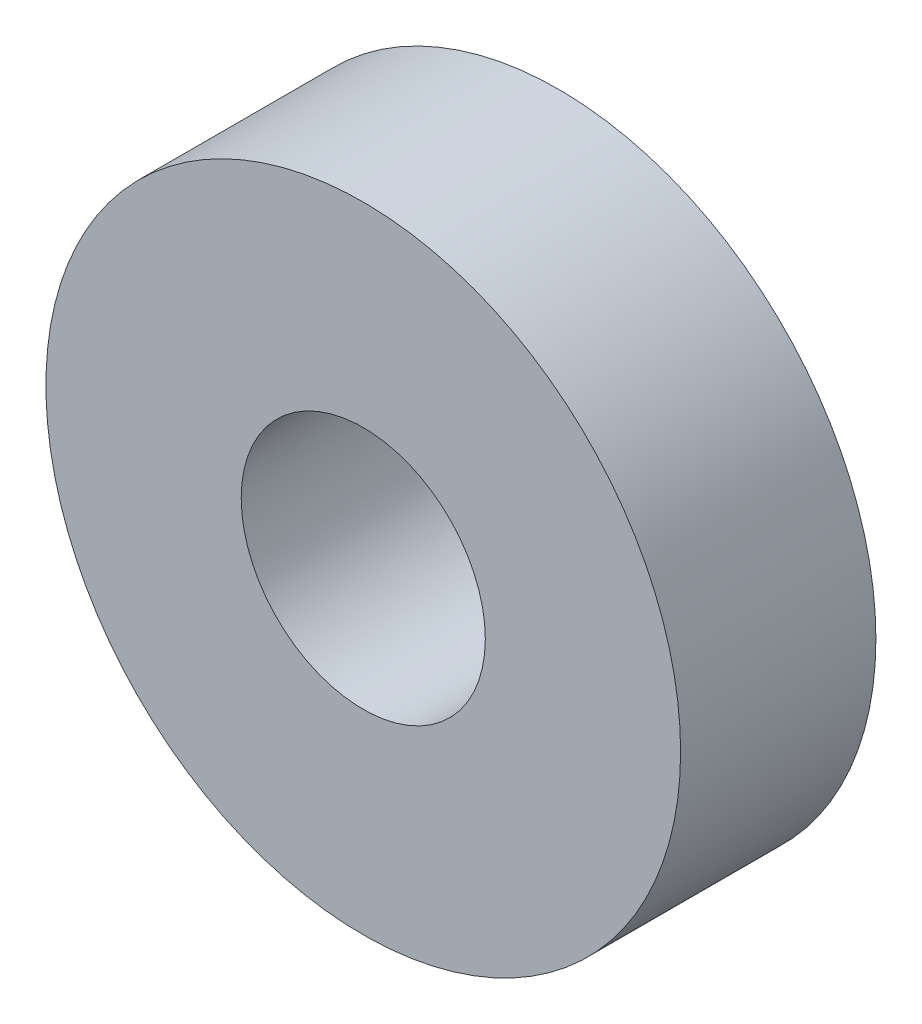
ISO-10303-21;
HEADER;
FILE_DESCRIPTION(('STEP AP214'),'2;1');
FILE_NAME('part.step','',(''),(''),'','','');
FILE_SCHEMA(('AUTOMOTIVE_DESIGN { 1 0 10303 214 1 1 1 1 }'));
ENDSEC;
DATA;
#1=APPLICATION_CONTEXT('core data for automotive mechanical design processes');
#2=APPLICATION_PROTOCOL_DEFINITION('international standard','automotive_design',2000,#1);
#3=PRODUCT_CONTEXT('',#1,'mechanical');
#4=PRODUCT('Part','Part','',(#3));
#5=PRODUCT_RELATED_PRODUCT_CATEGORY('part','',(#4));
#6=PRODUCT_DEFINITION_FORMATION('','',#4);
#7=PRODUCT_DEFINITION_CONTEXT('part definition',#1,'design');
#8=PRODUCT_DEFINITION('design','',#6,#7);
#9=PRODUCT_DEFINITION_SHAPE('','',#8);
#10=(LENGTH_UNIT() NAMED_UNIT(*) SI_UNIT(.MILLI.,.METRE.));
#11=(NAMED_UNIT(*) PLANE_ANGLE_UNIT() SI_UNIT($,.RADIAN.));
#12=(NAMED_UNIT(*) SI_UNIT($,.STERADIAN.) SOLID_ANGLE_UNIT());
#13=UNCERTAINTY_MEASURE_WITH_UNIT(LENGTH_MEASURE(1.E-05),#10,'distance_accuracy_value','');
#14=(GEOMETRIC_REPRESENTATION_CONTEXT(3) GLOBAL_UNCERTAINTY_ASSIGNED_CONTEXT((#13)) GLOBAL_UNIT_ASSIGNED_CONTEXT((#10,
#11,#12)) REPRESENTATION_CONTEXT('',''));
#15=CARTESIAN_POINT('',(0.,0.,0.));
#16=DIRECTION('',(0.,0.,1.));
#17=DIRECTION('',(1.,0.,0.));
#18=AXIS2_PLACEMENT_3D('',#15,#16,#17);
#19=CARTESIAN_POINT('',(0.,0.,2.));
#20=DIRECTION('',(0.,0.,1.));
#21=DIRECTION('',(1.,0.,0.));
#22=AXIS2_PLACEMENT_3D('',#19,#20,#21);
#23=PLANE('',#22);
#24=CARTESIAN_POINT('',(0.,0.,2.));
#25=DIRECTION('',(0.,0.,1.));
#26=DIRECTION('',(1.,0.,0.));
#27=AXIS2_PLACEMENT_3D('',#24,#25,#26);
#28=CIRCLE('',#27,3.25);
#29=CARTESIAN_POINT('',(3.25,0.,2.));
#30=VERTEX_POINT('',#29);
#31=EDGE_CURVE('E10',#30,#30,#28,.T.);
#32=ORIENTED_EDGE('',*,*,#31,.T.);
#33=EDGE_LOOP('',(#32));
#34=FACE_BOUND('',#33,.T.);
#35=CARTESIAN_POINT('',(0.,0.,2.));
#36=DIRECTION('',(0.,0.,1.));
#37=DIRECTION('',(1.,0.,0.));
#38=AXIS2_PLACEMENT_3D('',#35,#36,#37);
#39=CIRCLE('',#38,1.25);
#40=CARTESIAN_POINT('',(1.25,0.,2.));
#41=VERTEX_POINT('',#40);
#42=EDGE_CURVE('E44',#41,#41,#39,.T.);
#43=ORIENTED_EDGE('',*,*,#42,.F.);
#44=EDGE_LOOP('',(#43));
#45=FACE_BOUND('',#44,.T.);
#46=ADVANCED_FACE('F33',(#34,#45),#23,.T.);
#47=CARTESIAN_POINT('',(0.,0.,0.));
#48=DIRECTION('',(0.,0.,1.));
#49=DIRECTION('',(1.,0.,0.));
#50=AXIS2_PLACEMENT_3D('',#47,#48,#49);
#51=PLANE('',#50);
#52=CARTESIAN_POINT('',(0.,0.,0.));
#53=DIRECTION('',(0.,0.,1.));
#54=DIRECTION('',(1.,0.,0.));
#55=AXIS2_PLACEMENT_3D('',#52,#53,#54);
#56=CIRCLE('',#55,3.25);
#57=CARTESIAN_POINT('',(3.25,0.,0.));
#58=VERTEX_POINT('',#57);
#59=EDGE_CURVE('E37',#58,#58,#56,.T.);
#60=ORIENTED_EDGE('',*,*,#59,.F.);
#61=EDGE_LOOP('',(#60));
#62=FACE_BOUND('',#61,.T.);
#63=CARTESIAN_POINT('',(0.,0.,0.));
#64=DIRECTION('',(0.,0.,1.));
#65=DIRECTION('',(1.,0.,0.));
#66=AXIS2_PLACEMENT_3D('',#63,#64,#65);
#67=CIRCLE('',#66,1.25);
#68=CARTESIAN_POINT('',(1.25,0.,0.));
#69=VERTEX_POINT('',#68);
#70=EDGE_CURVE('E46',#69,#69,#67,.T.);
#71=ORIENTED_EDGE('',*,*,#70,.T.);
#72=EDGE_LOOP('',(#71));
#73=FACE_BOUND('',#72,.T.);
#74=ADVANCED_FACE('F56',(#62,#73),#51,.F.);
#75=CARTESIAN_POINT('',(0.,0.,2.));
#76=DIRECTION('',(0.,0.,-1.));
#77=DIRECTION('',(-1.,0.,0.));
#78=AXIS2_PLACEMENT_3D('',#75,#76,#77);
#79=CYLINDRICAL_SURFACE('',#78,3.25);
#80=ORIENTED_EDGE('',*,*,#31,.F.);
#81=EDGE_LOOP('',(#80));
#82=FACE_BOUND('',#81,.T.);
#83=ORIENTED_EDGE('',*,*,#59,.T.);
#84=EDGE_LOOP('',(#83));
#85=FACE_BOUND('',#84,.T.);
#86=ADVANCED_FACE('F35',(#82,#85),#79,.T.);
#87=CARTESIAN_POINT('',(0.,0.,2.));
#88=DIRECTION('',(0.,0.,-1.));
#89=DIRECTION('',(-1.,0.,0.));
#90=AXIS2_PLACEMENT_3D('',#87,#88,#89);
#91=CYLINDRICAL_SURFACE('',#90,1.25);
#92=ORIENTED_EDGE('',*,*,#42,.T.);
#93=EDGE_LOOP('',(#92));
#94=FACE_BOUND('',#93,.T.);
#95=ORIENTED_EDGE('',*,*,#70,.F.);
#96=EDGE_LOOP('',(#95));
#97=FACE_BOUND('',#96,.T.);
#98=ADVANCED_FACE('F52',(#94,#97),#91,.F.);
#99=CLOSED_SHELL('',(#46,#74,#86,#98));
#100=MANIFOLD_SOLID_BREP('B2',#99);
#101=ADVANCED_BREP_SHAPE_REPRESENTATION('',(#18,#100),#14);
#102=SHAPE_DEFINITION_REPRESENTATION(#9,#101);
ENDSEC;
END-ISO-10303-21;
